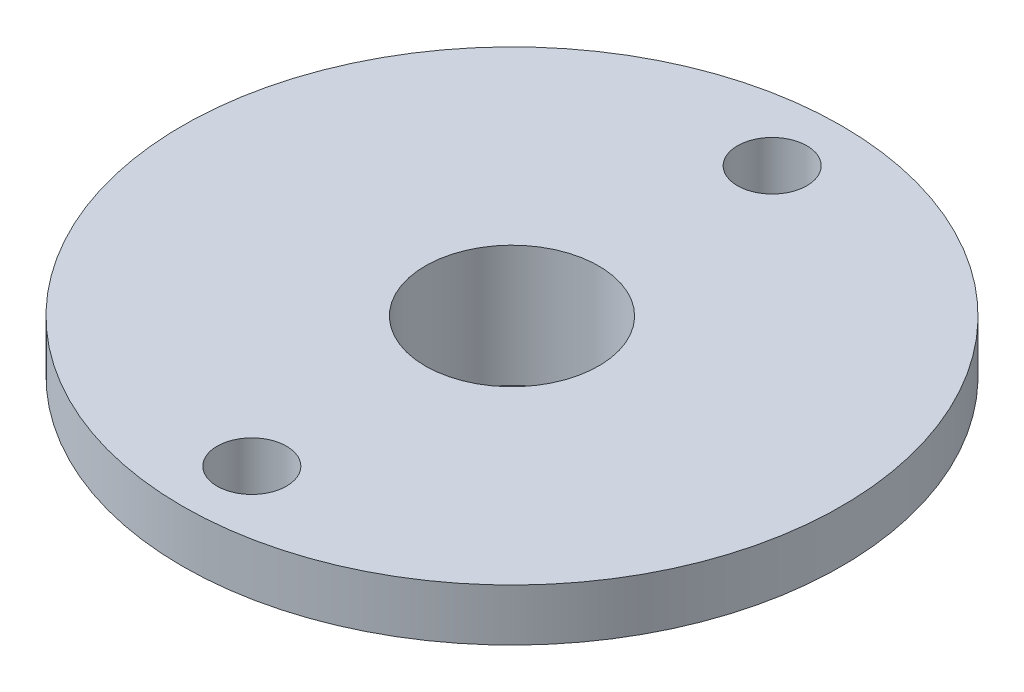
ISO-10303-21;
HEADER;
FILE_DESCRIPTION(('STEP AP214'),'2;1');
FILE_NAME('part.step','',(''),(''),'','','');
FILE_SCHEMA(('AUTOMOTIVE_DESIGN { 1 0 10303 214 1 1 1 1 }'));
ENDSEC;
DATA;
#1=APPLICATION_CONTEXT('core data for automotive mechanical design processes');
#2=APPLICATION_PROTOCOL_DEFINITION('international standard','automotive_design',2000,#1);
#3=PRODUCT_CONTEXT('',#1,'mechanical');
#4=PRODUCT('Part','Part','',(#3));
#5=PRODUCT_RELATED_PRODUCT_CATEGORY('part','',(#4));
#6=PRODUCT_DEFINITION_FORMATION('','',#4);
#7=PRODUCT_DEFINITION_CONTEXT('part definition',#1,'design');
#8=PRODUCT_DEFINITION('design','',#6,#7);
#9=PRODUCT_DEFINITION_SHAPE('','',#8);
#10=(LENGTH_UNIT() NAMED_UNIT(*) SI_UNIT(.MILLI.,.METRE.));
#11=(NAMED_UNIT(*) PLANE_ANGLE_UNIT() SI_UNIT($,.RADIAN.));
#12=(NAMED_UNIT(*) SI_UNIT($,.STERADIAN.) SOLID_ANGLE_UNIT());
#13=UNCERTAINTY_MEASURE_WITH_UNIT(LENGTH_MEASURE(1.E-05),#10,'distance_accuracy_value','');
#14=(GEOMETRIC_REPRESENTATION_CONTEXT(3) GLOBAL_UNCERTAINTY_ASSIGNED_CONTEXT((#13)) GLOBAL_UNIT_ASSIGNED_CONTEXT((#10,
#11,#12)) REPRESENTATION_CONTEXT('',''));
#15=CARTESIAN_POINT('',(0.,0.,0.));
#16=DIRECTION('',(0.,0.,1.));
#17=DIRECTION('',(1.,0.,0.));
#18=AXIS2_PLACEMENT_3D('',#15,#16,#17);
#19=CARTESIAN_POINT('',(0.,2.,0.));
#20=DIRECTION('',(0.,-1.,0.));
#21=DIRECTION('',(0.,0.,-1.));
#22=AXIS2_PLACEMENT_3D('',#19,#20,#21);
#23=CYLINDRICAL_SURFACE('',#22,5.);
#24=CARTESIAN_POINT('',(0.,2.,0.));
#25=DIRECTION('',(0.,1.,0.));
#26=DIRECTION('',(0.,0.,1.));
#27=AXIS2_PLACEMENT_3D('',#24,#25,#26);
#28=CIRCLE('',#27,5.);
#29=CARTESIAN_POINT('',(0.,2.,5.));
#30=VERTEX_POINT('',#29);
#31=EDGE_CURVE('E10',#30,#30,#28,.T.);
#32=ORIENTED_EDGE('',*,*,#31,.F.);
#33=EDGE_LOOP('',(#32));
#34=FACE_BOUND('',#33,.T.);
#35=CARTESIAN_POINT('',(0.,0.,0.));
#36=DIRECTION('',(0.,1.,0.));
#37=DIRECTION('',(0.,0.,1.));
#38=AXIS2_PLACEMENT_3D('',#35,#36,#37);
#39=CIRCLE('',#38,5.);
#40=CARTESIAN_POINT('',(0.,0.,5.));
#41=VERTEX_POINT('',#40);
#42=EDGE_CURVE('E31',#41,#41,#39,.T.);
#43=ORIENTED_EDGE('',*,*,#42,.T.);
#44=EDGE_LOOP('',(#43));
#45=FACE_BOUND('',#44,.T.);
#46=ADVANCED_FACE('F28',(#34,#45),#23,.T.);
#47=CARTESIAN_POINT('',(0.,0.,0.));
#48=DIRECTION('',(0.,1.,0.));
#49=DIRECTION('',(0.,0.,1.));
#50=AXIS2_PLACEMENT_3D('',#47,#48,#49);
#51=PLANE('',#50);
#52=CARTESIAN_POINT('',(0.,0.,0.));
#53=DIRECTION('',(0.,1.,0.));
#54=DIRECTION('',(0.,0.,1.));
#55=AXIS2_PLACEMENT_3D('',#52,#53,#54);
#56=CIRCLE('',#55,2.5);
#57=CARTESIAN_POINT('',(0.,0.,2.5));
#58=VERTEX_POINT('',#57);
#59=EDGE_CURVE('E43',#58,#58,#56,.T.);
#60=ORIENTED_EDGE('',*,*,#59,.T.);
#61=EDGE_LOOP('',(#60));
#62=FACE_BOUND('',#61,.T.);
#63=ORIENTED_EDGE('',*,*,#42,.F.);
#64=EDGE_LOOP('',(#63));
#65=FACE_BOUND('',#64,.T.);
#66=ADVANCED_FACE('F86',(#62,#65),#51,.F.);
#67=CARTESIAN_POINT('',(0.,2.,0.));
#68=DIRECTION('',(0.,1.,0.));
#69=DIRECTION('',(0.,0.,1.));
#70=AXIS2_PLACEMENT_3D('',#67,#68,#69);
#71=PLANE('',#70);
#72=CARTESIAN_POINT('',(0.,2.,7.5));
#73=DIRECTION('',(0.,1.,0.));
#74=DIRECTION('',(0.,0.,1.));
#75=AXIS2_PLACEMENT_3D('',#72,#73,#74);
#76=CIRCLE('',#75,1.);
#77=CARTESIAN_POINT('',(0.,2.,8.5));
#78=VERTEX_POINT('',#77);
#79=EDGE_CURVE('E57',#78,#78,#76,.T.);
#80=ORIENTED_EDGE('',*,*,#79,.T.);
#81=EDGE_LOOP('',(#80));
#82=FACE_BOUND('',#81,.T.);
#83=CARTESIAN_POINT('',(0.,2.,-7.5));
#84=DIRECTION('',(0.,1.,0.));
#85=DIRECTION('',(0.,0.,1.));
#86=AXIS2_PLACEMENT_3D('',#83,#84,#85);
#87=CIRCLE('',#86,1.);
#88=CARTESIAN_POINT('',(0.,2.,-6.5));
#89=VERTEX_POINT('',#88);
#90=EDGE_CURVE('E49',#89,#89,#87,.T.);
#91=ORIENTED_EDGE('',*,*,#90,.T.);
#92=EDGE_LOOP('',(#91));
#93=FACE_BOUND('',#92,.T.);
#94=CARTESIAN_POINT('',(0.,2.,0.));
#95=DIRECTION('',(0.,1.,0.));
#96=DIRECTION('',(0.,0.,1.));
#97=AXIS2_PLACEMENT_3D('',#94,#95,#96);
#98=CIRCLE('',#97,9.5);
#99=CARTESIAN_POINT('',(0.,2.,9.5));
#100=VERTEX_POINT('',#99);
#101=EDGE_CURVE('E40',#100,#100,#98,.T.);
#102=ORIENTED_EDGE('',*,*,#101,.F.);
#103=EDGE_LOOP('',(#102));
#104=FACE_BOUND('',#103,.T.);
#105=ORIENTED_EDGE('',*,*,#31,.T.);
#106=EDGE_LOOP('',(#105));
#107=FACE_BOUND('',#106,.T.);
#108=ADVANCED_FACE('F81',(#82,#93,#104,#107),#71,.F.);
#109=CARTESIAN_POINT('',(0.,3.5,0.));
#110=DIRECTION('',(0.,-1.,0.));
#111=DIRECTION('',(0.,0.,-1.));
#112=AXIS2_PLACEMENT_3D('',#109,#110,#111);
#113=CYLINDRICAL_SURFACE('',#112,9.5);
#114=CARTESIAN_POINT('',(0.,3.5,0.));
#115=DIRECTION('',(0.,1.,0.));
#116=DIRECTION('',(0.,0.,1.));
#117=AXIS2_PLACEMENT_3D('',#114,#115,#116);
#118=CIRCLE('',#117,9.5);
#119=CARTESIAN_POINT('',(0.,3.5,9.5));
#120=VERTEX_POINT('',#119);
#121=EDGE_CURVE('E38',#120,#120,#118,.T.);
#122=ORIENTED_EDGE('',*,*,#121,.F.);
#123=EDGE_LOOP('',(#122));
#124=FACE_BOUND('',#123,.T.);
#125=ORIENTED_EDGE('',*,*,#101,.T.);
#126=EDGE_LOOP('',(#125));
#127=FACE_BOUND('',#126,.T.);
#128=ADVANCED_FACE('F71',(#124,#127),#113,.T.);
#129=CARTESIAN_POINT('',(0.,3.5,0.));
#130=DIRECTION('',(0.,1.,0.));
#131=DIRECTION('',(0.,0.,1.));
#132=AXIS2_PLACEMENT_3D('',#129,#130,#131);
#133=PLANE('',#132);
#134=CARTESIAN_POINT('',(0.,3.5,7.5));
#135=DIRECTION('',(0.,1.,0.));
#136=DIRECTION('',(0.,0.,1.));
#137=AXIS2_PLACEMENT_3D('',#134,#135,#136);
#138=CIRCLE('',#137,1.);
#139=CARTESIAN_POINT('',(0.,3.5,8.5));
#140=VERTEX_POINT('',#139);
#141=EDGE_CURVE('E60',#140,#140,#138,.T.);
#142=ORIENTED_EDGE('',*,*,#141,.F.);
#143=EDGE_LOOP('',(#142));
#144=FACE_BOUND('',#143,.T.);
#145=CARTESIAN_POINT('',(0.,3.5,-7.5));
#146=DIRECTION('',(0.,1.,0.));
#147=DIRECTION('',(0.,0.,1.));
#148=AXIS2_PLACEMENT_3D('',#145,#146,#147);
#149=CIRCLE('',#148,1.);
#150=CARTESIAN_POINT('',(0.,3.5,-6.5));
#151=VERTEX_POINT('',#150);
#152=EDGE_CURVE('E54',#151,#151,#149,.T.);
#153=ORIENTED_EDGE('',*,*,#152,.F.);
#154=EDGE_LOOP('',(#153));
#155=FACE_BOUND('',#154,.T.);
#156=CARTESIAN_POINT('',(0.,3.5,0.));
#157=DIRECTION('',(0.,1.,0.));
#158=DIRECTION('',(0.,0.,1.));
#159=AXIS2_PLACEMENT_3D('',#156,#157,#158);
#160=CIRCLE('',#159,2.5);
#161=CARTESIAN_POINT('',(0.,3.5,2.5));
#162=VERTEX_POINT('',#161);
#163=EDGE_CURVE('E46',#162,#162,#160,.T.);
#164=ORIENTED_EDGE('',*,*,#163,.F.);
#165=EDGE_LOOP('',(#164));
#166=FACE_BOUND('',#165,.T.);
#167=ORIENTED_EDGE('',*,*,#121,.T.);
#168=EDGE_LOOP('',(#167));
#169=FACE_BOUND('',#168,.T.);
#170=ADVANCED_FACE('F67',(#144,#155,#166,#169),#133,.T.);
#171=CARTESIAN_POINT('',(0.,0.,0.));
#172=DIRECTION('',(0.,1.,0.));
#173=DIRECTION('',(0.,0.,1.));
#174=AXIS2_PLACEMENT_3D('',#171,#172,#173);
#175=CYLINDRICAL_SURFACE('',#174,2.5);
#176=ORIENTED_EDGE('',*,*,#59,.F.);
#177=EDGE_LOOP('',(#176));
#178=FACE_BOUND('',#177,.T.);
#179=ORIENTED_EDGE('',*,*,#163,.T.);
#180=EDGE_LOOP('',(#179));
#181=FACE_BOUND('',#180,.T.);
#182=ADVANCED_FACE('F70',(#178,#181),#175,.F.);
#183=CARTESIAN_POINT('',(0.,0.,-7.5));
#184=DIRECTION('',(0.,1.,0.));
#185=DIRECTION('',(0.,0.,1.));
#186=AXIS2_PLACEMENT_3D('',#183,#184,#185);
#187=CYLINDRICAL_SURFACE('',#186,1.);
#188=ORIENTED_EDGE('',*,*,#152,.T.);
#189=EDGE_LOOP('',(#188));
#190=FACE_BOUND('',#189,.T.);
#191=ORIENTED_EDGE('',*,*,#90,.F.);
#192=EDGE_LOOP('',(#191));
#193=FACE_BOUND('',#192,.T.);
#194=ADVANCED_FACE('F127',(#190,#193),#187,.F.);
#195=CARTESIAN_POINT('',(0.,0.,7.5));
#196=DIRECTION('',(0.,1.,0.));
#197=DIRECTION('',(0.,0.,1.));
#198=AXIS2_PLACEMENT_3D('',#195,#196,#197);
#199=CYLINDRICAL_SURFACE('',#198,1.);
#200=ORIENTED_EDGE('',*,*,#141,.T.);
#201=EDGE_LOOP('',(#200));
#202=FACE_BOUND('',#201,.T.);
#203=ORIENTED_EDGE('',*,*,#79,.F.);
#204=EDGE_LOOP('',(#203));
#205=FACE_BOUND('',#204,.T.);
#206=ADVANCED_FACE('F64',(#202,#205),#199,.F.);
#207=CLOSED_SHELL('',(#46,#66,#108,#128,#170,#182,#194,#206));
#208=MANIFOLD_SOLID_BREP('B2',#207);
#209=ADVANCED_BREP_SHAPE_REPRESENTATION('',(#18,#208),#14);
#210=SHAPE_DEFINITION_REPRESENTATION(#9,#209);
ENDSEC;
END-ISO-10303-21;
